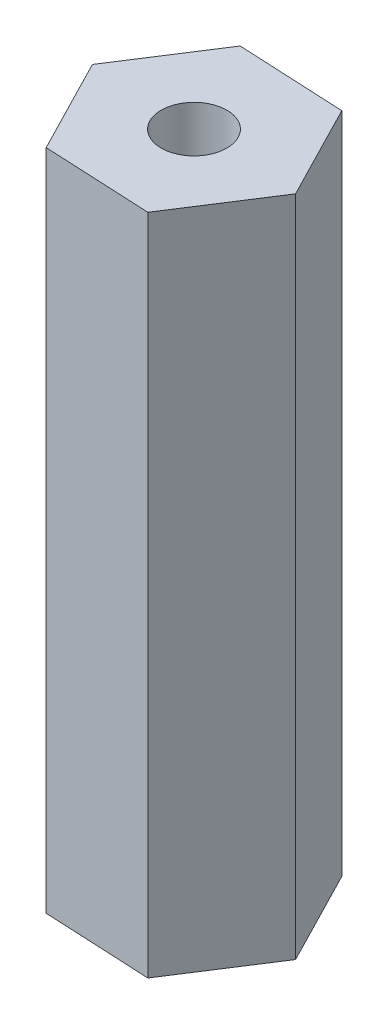
ISO-10303-21;
HEADER;
FILE_DESCRIPTION(('STEP AP214'),'2;1');
FILE_NAME('part.step','',(''),(''),'','','');
FILE_SCHEMA(('AUTOMOTIVE_DESIGN { 1 0 10303 214 1 1 1 1 }'));
ENDSEC;
DATA;
#1=APPLICATION_CONTEXT('core data for automotive mechanical design processes');
#2=APPLICATION_PROTOCOL_DEFINITION('international standard','automotive_design',2000,#1);
#3=PRODUCT_CONTEXT('',#1,'mechanical');
#4=PRODUCT('Part','Part','',(#3));
#5=PRODUCT_RELATED_PRODUCT_CATEGORY('part','',(#4));
#6=PRODUCT_DEFINITION_FORMATION('','',#4);
#7=PRODUCT_DEFINITION_CONTEXT('part definition',#1,'design');
#8=PRODUCT_DEFINITION('design','',#6,#7);
#9=PRODUCT_DEFINITION_SHAPE('','',#8);
#10=(LENGTH_UNIT() NAMED_UNIT(*) SI_UNIT(.MILLI.,.METRE.));
#11=(NAMED_UNIT(*) PLANE_ANGLE_UNIT() SI_UNIT($,.RADIAN.));
#12=(NAMED_UNIT(*) SI_UNIT($,.STERADIAN.) SOLID_ANGLE_UNIT());
#13=UNCERTAINTY_MEASURE_WITH_UNIT(LENGTH_MEASURE(1.E-05),#10,'distance_accuracy_value','');
#14=(GEOMETRIC_REPRESENTATION_CONTEXT(3) GLOBAL_UNCERTAINTY_ASSIGNED_CONTEXT((#13)) GLOBAL_UNIT_ASSIGNED_CONTEXT((#10,
#11,#12)) REPRESENTATION_CONTEXT('',''));
#15=CARTESIAN_POINT('',(0.,0.,0.));
#16=DIRECTION('',(0.,0.,1.));
#17=DIRECTION('',(1.,0.,0.));
#18=AXIS2_PLACEMENT_3D('',#15,#16,#17);
#19=CARTESIAN_POINT('',(1.93898368371843,22.20000005,-3.00893263593705));
#20=DIRECTION('',(-0.0488166813838843,0.,0.998807755085364));
#21=DIRECTION('',(0.998807755085364,0.,0.0488166813838843));
#22=AXIS2_PLACEMENT_3D('',#19,#20,#21);
#23=PLANE('',#22);
#24=DIRECTION('',(-0.998807755085364,0.,-0.0488166813838843));
#25=VECTOR('',#24,1.);
#26=CARTESIAN_POINT('',(1.93898368371843,0.,-3.00893263593705));
#27=LINE('',#26,#25);
#28=CARTESIAN_POINT('',(1.93898368371843,0.,-3.00893263593705));
#29=VERTEX_POINT('',#28);
#30=CARTESIAN_POINT('',(-1.63632025913834,0.,-3.18367544559221));
#31=VERTEX_POINT('',#30);
#32=EDGE_CURVE('E118',#29,#31,#27,.T.);
#33=ORIENTED_EDGE('',*,*,#32,.T.);
#34=DIRECTION('',(0.,-1.,0.));
#35=VECTOR('',#34,1.);
#36=CARTESIAN_POINT('',(-1.63632025913834,22.20000005,-3.18367544559221));
#37=LINE('',#36,#35);
#38=CARTESIAN_POINT('',(-1.63632025913834,22.20000005,-3.18367544559221));
#39=VERTEX_POINT('',#38);
#40=EDGE_CURVE('E11',#39,#31,#37,.T.);
#41=ORIENTED_EDGE('',*,*,#40,.F.);
#42=DIRECTION('',(-0.998807755085364,0.,-0.0488166813838843));
#43=VECTOR('',#42,1.);
#44=CARTESIAN_POINT('',(1.93898368371843,22.20000005,-3.00893263593705));
#45=LINE('',#44,#43);
#46=CARTESIAN_POINT('',(1.93898368371843,22.20000005,-3.00893263593705));
#47=VERTEX_POINT('',#46);
#48=EDGE_CURVE('E129',#47,#39,#45,.T.);
#49=ORIENTED_EDGE('',*,*,#48,.F.);
#50=DIRECTION('',(0.,-1.,0.));
#51=VECTOR('',#50,1.);
#52=CARTESIAN_POINT('',(1.93898368371843,22.20000005,-3.00893263593705));
#53=LINE('',#52,#51);
#54=EDGE_CURVE('E114',#47,#29,#53,.T.);
#55=ORIENTED_EDGE('',*,*,#54,.T.);
#56=EDGE_LOOP('',(#33,#41,#49,#55));
#57=FACE_BOUND('',#56,.T.);
#58=ADVANCED_FACE('F34',(#57),#23,.F.);
#59=CARTESIAN_POINT('',(-1.63632025913834,22.20000005,-3.18367544559221));
#60=DIRECTION('',(0.840584548708889,0.,0.541680363749577));
#61=DIRECTION('',(0.541680363749577,0.,-0.840584548708889));
#62=AXIS2_PLACEMENT_3D('',#59,#60,#61);
#63=PLANE('',#62);
#64=DIRECTION('',(-0.541680363749577,0.,0.840584548708889));
#65=VECTOR('',#64,1.);
#66=CARTESIAN_POINT('',(-1.63632025913834,0.,-3.18367544559221));
#67=LINE('',#66,#65);
#68=CARTESIAN_POINT('',(-3.57530394285677,0.,-0.174742809655165));
#69=VERTEX_POINT('',#68);
#70=EDGE_CURVE('E121',#31,#69,#67,.T.);
#71=ORIENTED_EDGE('',*,*,#70,.T.);
#72=DIRECTION('',(0.,-1.,0.));
#73=VECTOR('',#72,1.);
#74=CARTESIAN_POINT('',(-3.57530394285677,22.20000005,-0.174742809655165));
#75=LINE('',#74,#73);
#76=CARTESIAN_POINT('',(-3.57530394285677,22.20000005,-0.174742809655165));
#77=VERTEX_POINT('',#76);
#78=EDGE_CURVE('E42',#77,#69,#75,.T.);
#79=ORIENTED_EDGE('',*,*,#78,.F.);
#80=DIRECTION('',(-0.541680363749577,0.,0.840584548708889));
#81=VECTOR('',#80,1.);
#82=CARTESIAN_POINT('',(-1.63632025913834,22.20000005,-3.18367544559221));
#83=LINE('',#82,#81);
#84=EDGE_CURVE('E87',#39,#77,#83,.T.);
#85=ORIENTED_EDGE('',*,*,#84,.F.);
#86=ORIENTED_EDGE('',*,*,#40,.T.);
#87=EDGE_LOOP('',(#71,#79,#85,#86));
#88=FACE_BOUND('',#87,.T.);
#89=ADVANCED_FACE('F154',(#88),#63,.F.);
#90=CARTESIAN_POINT('',(-3.57530394285677,22.20000005,-0.174742809655165));
#91=DIRECTION('',(0.889401230092773,0.,-0.457127391335787));
#92=DIRECTION('',(-0.457127391335787,0.,-0.889401230092773));
#93=AXIS2_PLACEMENT_3D('',#90,#91,#92);
#94=PLANE('',#93);
#95=DIRECTION('',(0.457127391335787,0.,0.889401230092773));
#96=VECTOR('',#95,1.);
#97=CARTESIAN_POINT('',(-3.57530394285677,0.,-0.174742809655165));
#98=LINE('',#97,#96);
#99=CARTESIAN_POINT('',(-1.93898368371843,0.,3.00893263593705));
#100=VERTEX_POINT('',#99);
#101=EDGE_CURVE('E124',#69,#100,#98,.T.);
#102=ORIENTED_EDGE('',*,*,#101,.T.);
#103=DIRECTION('',(0.,-1.,0.));
#104=VECTOR('',#103,1.);
#105=CARTESIAN_POINT('',(-1.93898368371843,22.20000005,3.00893263593705));
#106=LINE('',#105,#104);
#107=CARTESIAN_POINT('',(-1.93898368371843,22.20000005,3.00893263593705));
#108=VERTEX_POINT('',#107);
#109=EDGE_CURVE('E109',#108,#100,#106,.T.);
#110=ORIENTED_EDGE('',*,*,#109,.F.);
#111=DIRECTION('',(0.457127391335787,0.,0.889401230092773));
#112=VECTOR('',#111,1.);
#113=CARTESIAN_POINT('',(-3.57530394285677,22.20000005,-0.174742809655165));
#114=LINE('',#113,#112);
#115=EDGE_CURVE('E100',#77,#108,#114,.T.);
#116=ORIENTED_EDGE('',*,*,#115,.F.);
#117=ORIENTED_EDGE('',*,*,#78,.T.);
#118=EDGE_LOOP('',(#102,#110,#116,#117));
#119=FACE_BOUND('',#118,.T.);
#120=ADVANCED_FACE('F135',(#119),#94,.F.);
#121=CARTESIAN_POINT('',(-1.93898368371843,22.20000005,3.00893263593705));
#122=DIRECTION('',(0.0488166813838845,0.,-0.998807755085364));
#123=DIRECTION('',(-0.998807755085364,0.,-0.0488166813838845));
#124=AXIS2_PLACEMENT_3D('',#121,#122,#123);
#125=PLANE('',#124);
#126=DIRECTION('',(0.998807755085364,0.,0.0488166813838845));
#127=VECTOR('',#126,1.);
#128=CARTESIAN_POINT('',(-1.93898368371843,0.,3.00893263593705));
#129=LINE('',#128,#127);
#130=CARTESIAN_POINT('',(1.63632025913834,0.,3.18367544559221));
#131=VERTEX_POINT('',#130);
#132=EDGE_CURVE('E108',#100,#131,#129,.T.);
#133=ORIENTED_EDGE('',*,*,#132,.T.);
#134=DIRECTION('',(0.,-1.,0.));
#135=VECTOR('',#134,1.);
#136=CARTESIAN_POINT('',(1.63632025913834,22.20000005,3.18367544559221));
#137=LINE('',#136,#135);
#138=CARTESIAN_POINT('',(1.63632025913834,22.20000005,3.18367544559221));
#139=VERTEX_POINT('',#138);
#140=EDGE_CURVE('E105',#139,#131,#137,.T.);
#141=ORIENTED_EDGE('',*,*,#140,.F.);
#142=DIRECTION('',(0.998807755085364,0.,0.0488166813838845));
#143=VECTOR('',#142,1.);
#144=CARTESIAN_POINT('',(-1.93898368371843,22.20000005,3.00893263593705));
#145=LINE('',#144,#143);
#146=EDGE_CURVE('E94',#108,#139,#145,.T.);
#147=ORIENTED_EDGE('',*,*,#146,.F.);
#148=ORIENTED_EDGE('',*,*,#109,.T.);
#149=EDGE_LOOP('',(#133,#141,#147,#148));
#150=FACE_BOUND('',#149,.T.);
#151=ADVANCED_FACE('F106',(#150),#125,.F.);
#152=CARTESIAN_POINT('',(1.63632025913834,22.20000005,3.18367544559221));
#153=DIRECTION('',(-0.840584548708889,0.,-0.541680363749577));
#154=DIRECTION('',(-0.541680363749577,0.,0.840584548708889));
#155=AXIS2_PLACEMENT_3D('',#152,#153,#154);
#156=PLANE('',#155);
#157=DIRECTION('',(0.541680363749577,0.,-0.840584548708889));
#158=VECTOR('',#157,1.);
#159=CARTESIAN_POINT('',(1.63632025913834,0.,3.18367544559221));
#160=LINE('',#159,#158);
#161=CARTESIAN_POINT('',(3.57530394285677,0.,0.174742809655165));
#162=VERTEX_POINT('',#161);
#163=EDGE_CURVE('E73',#131,#162,#160,.T.);
#164=ORIENTED_EDGE('',*,*,#163,.T.);
#165=DIRECTION('',(0.,-1.,0.));
#166=VECTOR('',#165,1.);
#167=CARTESIAN_POINT('',(3.57530394285677,22.20000005,0.174742809655165));
#168=LINE('',#167,#166);
#169=CARTESIAN_POINT('',(3.57530394285677,22.20000005,0.174742809655165));
#170=VERTEX_POINT('',#169);
#171=EDGE_CURVE('E110',#170,#162,#168,.T.);
#172=ORIENTED_EDGE('',*,*,#171,.F.);
#173=DIRECTION('',(0.541680363749577,0.,-0.840584548708889));
#174=VECTOR('',#173,1.);
#175=CARTESIAN_POINT('',(1.63632025913834,22.20000005,3.18367544559221));
#176=LINE('',#175,#174);
#177=EDGE_CURVE('E98',#139,#170,#176,.T.);
#178=ORIENTED_EDGE('',*,*,#177,.F.);
#179=ORIENTED_EDGE('',*,*,#140,.T.);
#180=EDGE_LOOP('',(#164,#172,#178,#179));
#181=FACE_BOUND('',#180,.T.);
#182=ADVANCED_FACE('F112',(#181),#156,.F.);
#183=CARTESIAN_POINT('',(3.57530394285677,22.20000005,0.174742809655165));
#184=DIRECTION('',(-0.889401230092773,0.,0.457127391335787));
#185=DIRECTION('',(0.457127391335787,0.,0.889401230092773));
#186=AXIS2_PLACEMENT_3D('',#183,#184,#185);
#187=PLANE('',#186);
#188=DIRECTION('',(-0.457127391335787,0.,-0.889401230092773));
#189=VECTOR('',#188,1.);
#190=CARTESIAN_POINT('',(3.57530394285677,0.,0.174742809655165));
#191=LINE('',#190,#189);
#192=EDGE_CURVE('E79',#162,#29,#191,.T.);
#193=ORIENTED_EDGE('',*,*,#192,.T.);
#194=ORIENTED_EDGE('',*,*,#54,.F.);
#195=DIRECTION('',(-0.457127391335787,0.,-0.889401230092773));
#196=VECTOR('',#195,1.);
#197=CARTESIAN_POINT('',(3.57530394285677,22.20000005,0.174742809655165));
#198=LINE('',#197,#196);
#199=EDGE_CURVE('E50',#170,#47,#198,.T.);
#200=ORIENTED_EDGE('',*,*,#199,.F.);
#201=ORIENTED_EDGE('',*,*,#171,.T.);
#202=EDGE_LOOP('',(#193,#194,#200,#201));
#203=FACE_BOUND('',#202,.T.);
#204=ADVANCED_FACE('F142',(#203),#187,.F.);
#205=CARTESIAN_POINT('',(0.,22.20000005,0.));
#206=DIRECTION('',(0.,1.,0.));
#207=DIRECTION('',(0.,0.,1.));
#208=AXIS2_PLACEMENT_3D('',#205,#206,#207);
#209=PLANE('',#208);
#210=CARTESIAN_POINT('',(0.,22.20000005,0.));
#211=DIRECTION('',(0.,-1.,0.));
#212=DIRECTION('',(0.,0.,-1.));
#213=AXIS2_PLACEMENT_3D('',#210,#211,#212);
#214=CIRCLE('',#213,1.1);
#215=CARTESIAN_POINT('',(0.,22.20000005,-1.1));
#216=VERTEX_POINT('',#215);
#217=EDGE_CURVE('E122',#216,#216,#214,.T.);
#218=ORIENTED_EDGE('',*,*,#217,.T.);
#219=EDGE_LOOP('',(#218));
#220=FACE_BOUND('',#219,.T.);
#221=ORIENTED_EDGE('',*,*,#48,.T.);
#222=ORIENTED_EDGE('',*,*,#84,.T.);
#223=ORIENTED_EDGE('',*,*,#115,.T.);
#224=ORIENTED_EDGE('',*,*,#146,.T.);
#225=ORIENTED_EDGE('',*,*,#177,.T.);
#226=ORIENTED_EDGE('',*,*,#199,.T.);
#227=EDGE_LOOP('',(#221,#222,#223,#224,#225,#226));
#228=FACE_BOUND('',#227,.T.);
#229=ADVANCED_FACE('F96',(#220,#228),#209,.T.);
#230=CARTESIAN_POINT('',(0.,0.,0.));
#231=DIRECTION('',(0.,1.,0.));
#232=DIRECTION('',(0.,0.,1.));
#233=AXIS2_PLACEMENT_3D('',#230,#231,#232);
#234=PLANE('',#233);
#235=CARTESIAN_POINT('',(0.,0.,0.));
#236=DIRECTION('',(0.,-1.,0.));
#237=DIRECTION('',(0.,0.,-1.));
#238=AXIS2_PLACEMENT_3D('',#235,#236,#237);
#239=CIRCLE('',#238,1.1);
#240=CARTESIAN_POINT('',(0.,0.,-1.1));
#241=VERTEX_POINT('',#240);
#242=EDGE_CURVE('E209',#241,#241,#239,.T.);
#243=ORIENTED_EDGE('',*,*,#242,.F.);
#244=EDGE_LOOP('',(#243));
#245=FACE_BOUND('',#244,.T.);
#246=ORIENTED_EDGE('',*,*,#32,.F.);
#247=ORIENTED_EDGE('',*,*,#192,.F.);
#248=ORIENTED_EDGE('',*,*,#163,.F.);
#249=ORIENTED_EDGE('',*,*,#132,.F.);
#250=ORIENTED_EDGE('',*,*,#101,.F.);
#251=ORIENTED_EDGE('',*,*,#70,.F.);
#252=EDGE_LOOP('',(#246,#247,#248,#249,#250,#251));
#253=FACE_BOUND('',#252,.T.);
#254=ADVANCED_FACE('F138',(#245,#253),#234,.F.);
#255=CARTESIAN_POINT('',(0.,22.20000005,0.));
#256=DIRECTION('',(0.,-1.,0.));
#257=DIRECTION('',(0.,0.,-1.));
#258=AXIS2_PLACEMENT_3D('',#255,#256,#257);
#259=CYLINDRICAL_SURFACE('',#258,1.1);
#260=ORIENTED_EDGE('',*,*,#217,.F.);
#261=EDGE_LOOP('',(#260));
#262=FACE_BOUND('',#261,.T.);
#263=ORIENTED_EDGE('',*,*,#242,.T.);
#264=EDGE_LOOP('',(#263));
#265=FACE_BOUND('',#264,.T.);
#266=ADVANCED_FACE('F191',(#262,#265),#259,.F.);
#267=CLOSED_SHELL('',(#58,#89,#120,#151,#182,#204,#229,#254,#266));
#268=MANIFOLD_SOLID_BREP('B2',#267);
#269=ADVANCED_BREP_SHAPE_REPRESENTATION('',(#18,#268),#14);
#270=SHAPE_DEFINITION_REPRESENTATION(#9,#269);
ENDSEC;
END-ISO-10303-21;
